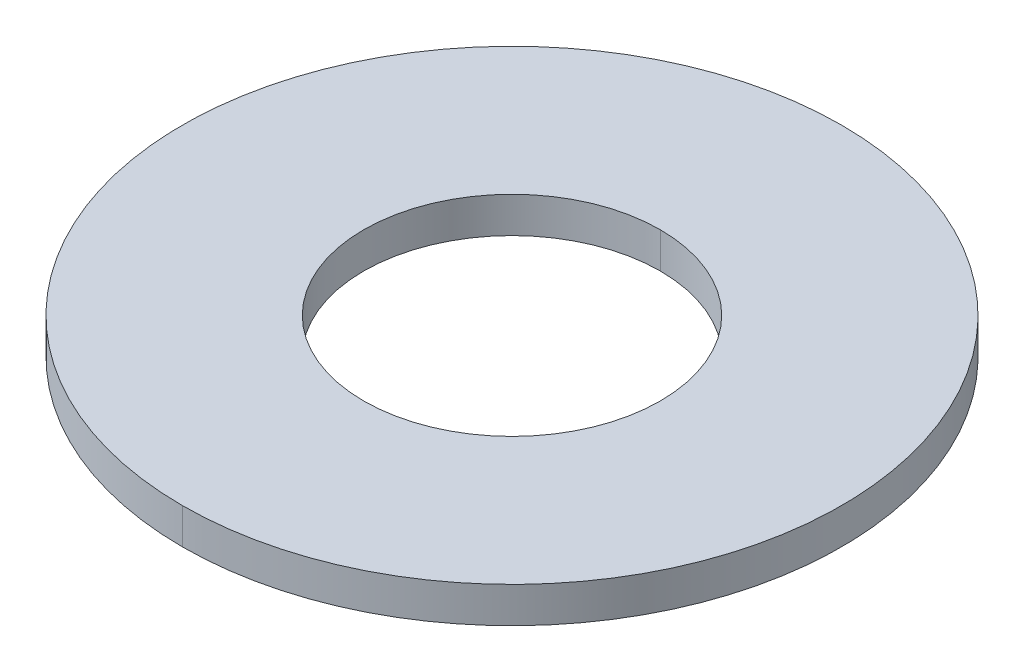
ISO-10303-21;
HEADER;
FILE_DESCRIPTION(('STEP AP214'),'2;1');
FILE_NAME('part.step','',(''),(''),'','','');
FILE_SCHEMA(('AUTOMOTIVE_DESIGN { 1 0 10303 214 1 1 1 1 }'));
ENDSEC;
DATA;
#1=APPLICATION_CONTEXT('core data for automotive mechanical design processes');
#2=APPLICATION_PROTOCOL_DEFINITION('international standard','automotive_design',2000,#1);
#3=PRODUCT_CONTEXT('',#1,'mechanical');
#4=PRODUCT('Part','Part','',(#3));
#5=PRODUCT_RELATED_PRODUCT_CATEGORY('part','',(#4));
#6=PRODUCT_DEFINITION_FORMATION('','',#4);
#7=PRODUCT_DEFINITION_CONTEXT('part definition',#1,'design');
#8=PRODUCT_DEFINITION('design','',#6,#7);
#9=PRODUCT_DEFINITION_SHAPE('','',#8);
#10=(LENGTH_UNIT() NAMED_UNIT(*) SI_UNIT(.MILLI.,.METRE.));
#11=(NAMED_UNIT(*) PLANE_ANGLE_UNIT() SI_UNIT($,.RADIAN.));
#12=(NAMED_UNIT(*) SI_UNIT($,.STERADIAN.) SOLID_ANGLE_UNIT());
#13=UNCERTAINTY_MEASURE_WITH_UNIT(LENGTH_MEASURE(1.E-05),#10,'distance_accuracy_value','');
#14=(GEOMETRIC_REPRESENTATION_CONTEXT(3) GLOBAL_UNCERTAINTY_ASSIGNED_CONTEXT((#13)) GLOBAL_UNIT_ASSIGNED_CONTEXT((#10,
#11,#12)) REPRESENTATION_CONTEXT('',''));
#15=CARTESIAN_POINT('',(0.,0.,0.));
#16=DIRECTION('',(0.,0.,1.));
#17=DIRECTION('',(1.,0.,0.));
#18=AXIS2_PLACEMENT_3D('',#15,#16,#17);
#19=CARTESIAN_POINT('',(0.,0.38,0.));
#20=DIRECTION('',(0.,-1.,0.));
#21=DIRECTION('',(0.,0.,-1.));
#22=AXIS2_PLACEMENT_3D('',#19,#20,#21);
#23=CYLINDRICAL_SURFACE('',#22,1.575);
#24=CARTESIAN_POINT('',(0.,0.38,0.));
#25=DIRECTION('',(0.,1.,0.));
#26=DIRECTION('',(0.,0.,1.));
#27=AXIS2_PLACEMENT_3D('',#24,#25,#26);
#28=CIRCLE('',#27,1.575);
#29=CARTESIAN_POINT('',(0.,0.38,-1.575));
#30=VERTEX_POINT('',#29);
#31=CARTESIAN_POINT('',(0.,0.38,1.575));
#32=VERTEX_POINT('',#31);
#33=EDGE_CURVE('E11',#30,#32,#28,.T.);
#34=ORIENTED_EDGE('',*,*,#33,.T.);
#35=DIRECTION('',(0.,-1.,0.));
#36=VECTOR('',#35,1.);
#37=CARTESIAN_POINT('',(0.,0.38,1.575));
#38=LINE('',#37,#36);
#39=CARTESIAN_POINT('',(0.,0.,1.575));
#40=VERTEX_POINT('',#39);
#41=EDGE_CURVE('E27',#32,#40,#38,.T.);
#42=ORIENTED_EDGE('',*,*,#41,.T.);
#43=CARTESIAN_POINT('',(0.,0.,0.));
#44=DIRECTION('',(0.,1.,0.));
#45=DIRECTION('',(0.,0.,1.));
#46=AXIS2_PLACEMENT_3D('',#43,#44,#45);
#47=CIRCLE('',#46,1.575);
#48=CARTESIAN_POINT('',(0.,0.,-1.575));
#49=VERTEX_POINT('',#48);
#50=EDGE_CURVE('E88',#49,#40,#47,.T.);
#51=ORIENTED_EDGE('',*,*,#50,.F.);
#52=DIRECTION('',(0.,-1.,0.));
#53=VECTOR('',#52,1.);
#54=CARTESIAN_POINT('',(0.,0.38,-1.575));
#55=LINE('',#54,#53);
#56=EDGE_CURVE('E68',#30,#49,#55,.T.);
#57=ORIENTED_EDGE('',*,*,#56,.F.);
#58=EDGE_LOOP('',(#34,#42,#51,#57));
#59=FACE_BOUND('',#58,.T.);
#60=ADVANCED_FACE('F16',(#59),#23,.F.);
#61=CARTESIAN_POINT('',(0.,0.38,0.));
#62=DIRECTION('',(0.,-1.,0.));
#63=DIRECTION('',(0.,0.,-1.));
#64=AXIS2_PLACEMENT_3D('',#61,#62,#63);
#65=CYLINDRICAL_SURFACE('',#64,3.5);
#66=CARTESIAN_POINT('',(0.,0.38,0.));
#67=DIRECTION('',(0.,1.,0.));
#68=DIRECTION('',(0.,0.,1.));
#69=AXIS2_PLACEMENT_3D('',#66,#67,#68);
#70=CIRCLE('',#69,3.5);
#71=CARTESIAN_POINT('',(0.,0.38,3.5));
#72=VERTEX_POINT('',#71);
#73=CARTESIAN_POINT('',(0.,0.38,-3.5));
#74=VERTEX_POINT('',#73);
#75=EDGE_CURVE('E77',#72,#74,#70,.T.);
#76=ORIENTED_EDGE('',*,*,#75,.F.);
#77=DIRECTION('',(0.,-1.,0.));
#78=VECTOR('',#77,1.);
#79=CARTESIAN_POINT('',(0.,0.38,3.5));
#80=LINE('',#79,#78);
#81=CARTESIAN_POINT('',(0.,0.,3.5));
#82=VERTEX_POINT('',#81);
#83=EDGE_CURVE('E81',#72,#82,#80,.T.);
#84=ORIENTED_EDGE('',*,*,#83,.T.);
#85=CARTESIAN_POINT('',(0.,0.,0.));
#86=DIRECTION('',(0.,1.,0.));
#87=DIRECTION('',(0.,0.,1.));
#88=AXIS2_PLACEMENT_3D('',#85,#86,#87);
#89=CIRCLE('',#88,3.5);
#90=CARTESIAN_POINT('',(0.,0.,-3.5));
#91=VERTEX_POINT('',#90);
#92=EDGE_CURVE('E94',#82,#91,#89,.T.);
#93=ORIENTED_EDGE('',*,*,#92,.T.);
#94=DIRECTION('',(0.,-1.,0.));
#95=VECTOR('',#94,1.);
#96=CARTESIAN_POINT('',(0.,0.38,-3.5));
#97=LINE('',#96,#95);
#98=EDGE_CURVE('E20',#74,#91,#97,.T.);
#99=ORIENTED_EDGE('',*,*,#98,.F.);
#100=EDGE_LOOP('',(#76,#84,#93,#99));
#101=FACE_BOUND('',#100,.T.);
#102=ADVANCED_FACE('F79',(#101),#65,.T.);
#103=CARTESIAN_POINT('',(0.,0.38,0.));
#104=DIRECTION('',(0.,1.,0.));
#105=DIRECTION('',(1.,0.,0.));
#106=AXIS2_PLACEMENT_3D('',#103,#104,#105);
#107=PLANE('',#106);
#108=CARTESIAN_POINT('',(0.,0.38,0.));
#109=DIRECTION('',(0.,1.,0.));
#110=DIRECTION('',(0.,0.,1.));
#111=AXIS2_PLACEMENT_3D('',#108,#109,#110);
#112=CIRCLE('',#111,3.5);
#113=EDGE_CURVE('E87',#74,#72,#112,.T.);
#114=ORIENTED_EDGE('',*,*,#113,.T.);
#115=ORIENTED_EDGE('',*,*,#75,.T.);
#116=EDGE_LOOP('',(#114,#115));
#117=FACE_BOUND('',#116,.T.);
#118=ORIENTED_EDGE('',*,*,#33,.F.);
#119=CARTESIAN_POINT('',(0.,0.38,0.));
#120=DIRECTION('',(0.,1.,0.));
#121=DIRECTION('',(0.,0.,1.));
#122=AXIS2_PLACEMENT_3D('',#119,#120,#121);
#123=CIRCLE('',#122,1.575);
#124=EDGE_CURVE('E112',#32,#30,#123,.T.);
#125=ORIENTED_EDGE('',*,*,#124,.F.);
#126=EDGE_LOOP('',(#118,#125));
#127=FACE_BOUND('',#126,.T.);
#128=ADVANCED_FACE('F96',(#117,#127),#107,.T.);
#129=CARTESIAN_POINT('',(0.,0.,0.));
#130=DIRECTION('',(0.,1.,0.));
#131=DIRECTION('',(1.,0.,0.));
#132=AXIS2_PLACEMENT_3D('',#129,#130,#131);
#133=PLANE('',#132);
#134=CARTESIAN_POINT('',(0.,0.,0.));
#135=DIRECTION('',(0.,1.,0.));
#136=DIRECTION('',(0.,0.,1.));
#137=AXIS2_PLACEMENT_3D('',#134,#135,#136);
#138=CIRCLE('',#137,3.5);
#139=EDGE_CURVE('E92',#91,#82,#138,.T.);
#140=ORIENTED_EDGE('',*,*,#139,.F.);
#141=ORIENTED_EDGE('',*,*,#92,.F.);
#142=EDGE_LOOP('',(#140,#141));
#143=FACE_BOUND('',#142,.T.);
#144=ORIENTED_EDGE('',*,*,#50,.T.);
#145=CARTESIAN_POINT('',(0.,0.,0.));
#146=DIRECTION('',(0.,1.,0.));
#147=DIRECTION('',(0.,0.,1.));
#148=AXIS2_PLACEMENT_3D('',#145,#146,#147);
#149=CIRCLE('',#148,1.575);
#150=EDGE_CURVE('E110',#40,#49,#149,.T.);
#151=ORIENTED_EDGE('',*,*,#150,.T.);
#152=EDGE_LOOP('',(#144,#151));
#153=FACE_BOUND('',#152,.T.);
#154=ADVANCED_FACE('F124',(#143,#153),#133,.F.);
#155=CARTESIAN_POINT('',(0.,0.38,0.));
#156=DIRECTION('',(0.,-1.,0.));
#157=DIRECTION('',(0.,0.,-1.));
#158=AXIS2_PLACEMENT_3D('',#155,#156,#157);
#159=CYLINDRICAL_SURFACE('',#158,3.5);
#160=ORIENTED_EDGE('',*,*,#83,.F.);
#161=ORIENTED_EDGE('',*,*,#113,.F.);
#162=ORIENTED_EDGE('',*,*,#98,.T.);
#163=ORIENTED_EDGE('',*,*,#139,.T.);
#164=EDGE_LOOP('',(#160,#161,#162,#163));
#165=FACE_BOUND('',#164,.T.);
#166=ADVANCED_FACE('F18',(#165),#159,.T.);
#167=CARTESIAN_POINT('',(0.,0.38,0.));
#168=DIRECTION('',(0.,-1.,0.));
#169=DIRECTION('',(0.,0.,-1.));
#170=AXIS2_PLACEMENT_3D('',#167,#168,#169);
#171=CYLINDRICAL_SURFACE('',#170,1.575);
#172=ORIENTED_EDGE('',*,*,#41,.F.);
#173=ORIENTED_EDGE('',*,*,#124,.T.);
#174=ORIENTED_EDGE('',*,*,#56,.T.);
#175=ORIENTED_EDGE('',*,*,#150,.F.);
#176=EDGE_LOOP('',(#172,#173,#174,#175));
#177=FACE_BOUND('',#176,.T.);
#178=ADVANCED_FACE('F128',(#177),#171,.F.);
#179=CLOSED_SHELL('',(#60,#102,#128,#154,#166,#178));
#180=MANIFOLD_SOLID_BREP('B1',#179);
#181=ADVANCED_BREP_SHAPE_REPRESENTATION('',(#18,#180),#14);
#182=SHAPE_DEFINITION_REPRESENTATION(#9,#181);
ENDSEC;
END-ISO-10303-21;
